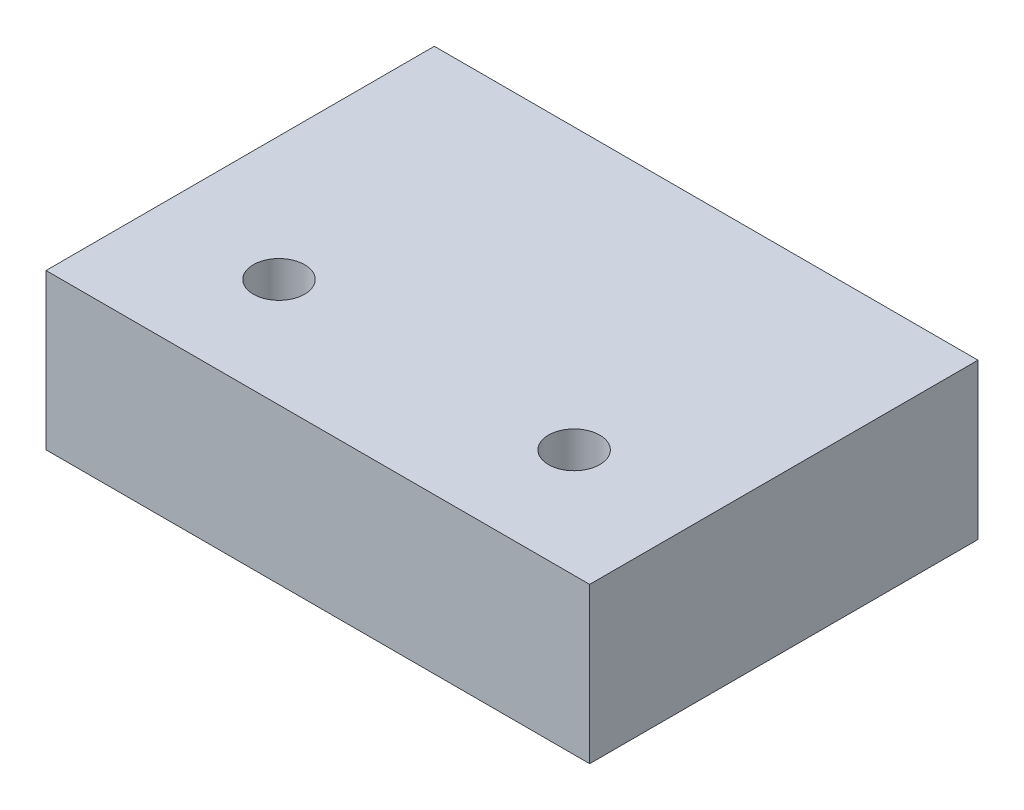
ISO-10303-21;
HEADER;
FILE_DESCRIPTION(('STEP AP214'),'2;1');
FILE_NAME('part.step','',(''),(''),'','','');
FILE_SCHEMA(('AUTOMOTIVE_DESIGN { 1 0 10303 214 1 1 1 1 }'));
ENDSEC;
DATA;
#1=APPLICATION_CONTEXT('core data for automotive mechanical design processes');
#2=APPLICATION_PROTOCOL_DEFINITION('international standard','automotive_design',2000,#1);
#3=PRODUCT_CONTEXT('',#1,'mechanical');
#4=PRODUCT('Part','Part','',(#3));
#5=PRODUCT_RELATED_PRODUCT_CATEGORY('part','',(#4));
#6=PRODUCT_DEFINITION_FORMATION('','',#4);
#7=PRODUCT_DEFINITION_CONTEXT('part definition',#1,'design');
#8=PRODUCT_DEFINITION('design','',#6,#7);
#9=PRODUCT_DEFINITION_SHAPE('','',#8);
#10=(LENGTH_UNIT() NAMED_UNIT(*) SI_UNIT(.MILLI.,.METRE.));
#11=(NAMED_UNIT(*) PLANE_ANGLE_UNIT() SI_UNIT($,.RADIAN.));
#12=(NAMED_UNIT(*) SI_UNIT($,.STERADIAN.) SOLID_ANGLE_UNIT());
#13=UNCERTAINTY_MEASURE_WITH_UNIT(LENGTH_MEASURE(1.E-05),#10,'distance_accuracy_value','');
#14=(GEOMETRIC_REPRESENTATION_CONTEXT(3) GLOBAL_UNCERTAINTY_ASSIGNED_CONTEXT((#13)) GLOBAL_UNIT_ASSIGNED_CONTEXT((#10,
#11,#12)) REPRESENTATION_CONTEXT('',''));
#15=CARTESIAN_POINT('',(0.,0.,0.));
#16=DIRECTION('',(0.,0.,1.));
#17=DIRECTION('',(1.,0.,0.));
#18=AXIS2_PLACEMENT_3D('',#15,#16,#17);
#19=CARTESIAN_POINT('',(17.5,10.,12.5));
#20=DIRECTION('',(-1.,0.,0.));
#21=DIRECTION('',(0.,0.,1.));
#22=AXIS2_PLACEMENT_3D('',#19,#20,#21);
#23=PLANE('',#22);
#24=DIRECTION('',(0.,0.,-1.));
#25=VECTOR('',#24,1.);
#26=CARTESIAN_POINT('',(17.5,0.,12.5));
#27=LINE('',#26,#25);
#28=CARTESIAN_POINT('',(17.5,0.,12.5));
#29=VERTEX_POINT('',#28);
#30=CARTESIAN_POINT('',(17.5,0.,-12.5));
#31=VERTEX_POINT('',#30);
#32=EDGE_CURVE('E96',#29,#31,#27,.T.);
#33=ORIENTED_EDGE('',*,*,#32,.T.);
#34=DIRECTION('',(0.,-1.,0.));
#35=VECTOR('',#34,1.);
#36=CARTESIAN_POINT('',(17.5,10.,-12.5));
#37=LINE('',#36,#35);
#38=CARTESIAN_POINT('',(17.5,10.,-12.5));
#39=VERTEX_POINT('',#38);
#40=EDGE_CURVE('E11',#39,#31,#37,.T.);
#41=ORIENTED_EDGE('',*,*,#40,.F.);
#42=DIRECTION('',(0.,0.,-1.));
#43=VECTOR('',#42,1.);
#44=CARTESIAN_POINT('',(17.5,10.,12.5));
#45=LINE('',#44,#43);
#46=CARTESIAN_POINT('',(17.5,10.,12.5));
#47=VERTEX_POINT('',#46);
#48=EDGE_CURVE('E84',#47,#39,#45,.T.);
#49=ORIENTED_EDGE('',*,*,#48,.F.);
#50=DIRECTION('',(0.,-1.,0.));
#51=VECTOR('',#50,1.);
#52=CARTESIAN_POINT('',(17.5,10.,12.5));
#53=LINE('',#52,#51);
#54=EDGE_CURVE('E92',#47,#29,#53,.T.);
#55=ORIENTED_EDGE('',*,*,#54,.T.);
#56=EDGE_LOOP('',(#33,#41,#49,#55));
#57=FACE_BOUND('',#56,.T.);
#58=ADVANCED_FACE('F33',(#57),#23,.F.);
#59=CARTESIAN_POINT('',(-17.5,10.,-12.5));
#60=DIRECTION('',(0.,0.,1.));
#61=DIRECTION('',(1.,0.,0.));
#62=AXIS2_PLACEMENT_3D('',#59,#60,#61);
#63=PLANE('',#62);
#64=DIRECTION('',(-1.,0.,0.));
#65=VECTOR('',#64,1.);
#66=CARTESIAN_POINT('',(-17.5,0.,-12.5));
#67=LINE('',#66,#65);
#68=CARTESIAN_POINT('',(-17.5,0.,-12.5));
#69=VERTEX_POINT('',#68);
#70=EDGE_CURVE('E88',#31,#69,#67,.T.);
#71=ORIENTED_EDGE('',*,*,#70,.T.);
#72=DIRECTION('',(0.,-1.,0.));
#73=VECTOR('',#72,1.);
#74=CARTESIAN_POINT('',(-17.5,10.,-12.5));
#75=LINE('',#74,#73);
#76=CARTESIAN_POINT('',(-17.5,10.,-12.5));
#77=VERTEX_POINT('',#76);
#78=EDGE_CURVE('E41',#77,#69,#75,.T.);
#79=ORIENTED_EDGE('',*,*,#78,.F.);
#80=DIRECTION('',(-1.,0.,0.));
#81=VECTOR('',#80,1.);
#82=CARTESIAN_POINT('',(-17.5,10.,-12.5));
#83=LINE('',#82,#81);
#84=EDGE_CURVE('E79',#39,#77,#83,.T.);
#85=ORIENTED_EDGE('',*,*,#84,.F.);
#86=ORIENTED_EDGE('',*,*,#40,.T.);
#87=EDGE_LOOP('',(#71,#79,#85,#86));
#88=FACE_BOUND('',#87,.T.);
#89=ADVANCED_FACE('F87',(#88),#63,.F.);
#90=CARTESIAN_POINT('',(-17.5,10.,12.5));
#91=DIRECTION('',(1.,0.,0.));
#92=DIRECTION('',(0.,0.,-1.));
#93=AXIS2_PLACEMENT_3D('',#90,#91,#92);
#94=PLANE('',#93);
#95=DIRECTION('',(0.,0.,1.));
#96=VECTOR('',#95,1.);
#97=CARTESIAN_POINT('',(-17.5,0.,12.5));
#98=LINE('',#97,#96);
#99=CARTESIAN_POINT('',(-17.5,0.,12.5));
#100=VERTEX_POINT('',#99);
#101=EDGE_CURVE('E66',#69,#100,#98,.T.);
#102=ORIENTED_EDGE('',*,*,#101,.T.);
#103=DIRECTION('',(0.,-1.,0.));
#104=VECTOR('',#103,1.);
#105=CARTESIAN_POINT('',(-17.5,10.,12.5));
#106=LINE('',#105,#104);
#107=CARTESIAN_POINT('',(-17.5,10.,12.5));
#108=VERTEX_POINT('',#107);
#109=EDGE_CURVE('E89',#108,#100,#106,.T.);
#110=ORIENTED_EDGE('',*,*,#109,.F.);
#111=DIRECTION('',(0.,0.,1.));
#112=VECTOR('',#111,1.);
#113=CARTESIAN_POINT('',(-17.5,10.,12.5));
#114=LINE('',#113,#112);
#115=EDGE_CURVE('E82',#77,#108,#114,.T.);
#116=ORIENTED_EDGE('',*,*,#115,.F.);
#117=ORIENTED_EDGE('',*,*,#78,.T.);
#118=EDGE_LOOP('',(#102,#110,#116,#117));
#119=FACE_BOUND('',#118,.T.);
#120=ADVANCED_FACE('F90',(#119),#94,.F.);
#121=CARTESIAN_POINT('',(-17.5,10.,12.5));
#122=DIRECTION('',(0.,0.,-1.));
#123=DIRECTION('',(-1.,0.,0.));
#124=AXIS2_PLACEMENT_3D('',#121,#122,#123);
#125=PLANE('',#124);
#126=DIRECTION('',(1.,0.,0.));
#127=VECTOR('',#126,1.);
#128=CARTESIAN_POINT('',(-17.5,0.,12.5));
#129=LINE('',#128,#127);
#130=EDGE_CURVE('E72',#100,#29,#129,.T.);
#131=ORIENTED_EDGE('',*,*,#130,.T.);
#132=ORIENTED_EDGE('',*,*,#54,.F.);
#133=DIRECTION('',(1.,0.,0.));
#134=VECTOR('',#133,1.);
#135=CARTESIAN_POINT('',(-17.5,10.,12.5));
#136=LINE('',#135,#134);
#137=EDGE_CURVE('E49',#108,#47,#136,.T.);
#138=ORIENTED_EDGE('',*,*,#137,.F.);
#139=ORIENTED_EDGE('',*,*,#109,.T.);
#140=EDGE_LOOP('',(#131,#132,#138,#139));
#141=FACE_BOUND('',#140,.T.);
#142=ADVANCED_FACE('F104',(#141),#125,.F.);
#143=CARTESIAN_POINT('',(0.,10.,0.));
#144=DIRECTION('',(0.,-1.,0.));
#145=DIRECTION('',(0.,0.,-1.));
#146=AXIS2_PLACEMENT_3D('',#143,#144,#145);
#147=PLANE('',#146);
#148=CARTESIAN_POINT('',(9.5,10.,5.5));
#149=DIRECTION('',(0.,1.,0.));
#150=DIRECTION('',(0.,0.,-1.));
#151=AXIS2_PLACEMENT_3D('',#148,#149,#150);
#152=CIRCLE('',#151,1.65);
#153=CARTESIAN_POINT('',(9.5,10.,3.85));
#154=VERTEX_POINT('',#153);
#155=EDGE_CURVE('E116',#154,#154,#152,.T.);
#156=ORIENTED_EDGE('',*,*,#155,.F.);
#157=EDGE_LOOP('',(#156));
#158=FACE_BOUND('',#157,.T.);
#159=CARTESIAN_POINT('',(-9.5,10.,5.5));
#160=DIRECTION('',(0.,1.,0.));
#161=DIRECTION('',(0.,0.,1.));
#162=AXIS2_PLACEMENT_3D('',#159,#160,#161);
#163=CIRCLE('',#162,1.65);
#164=CARTESIAN_POINT('',(-9.5,10.,7.15));
#165=VERTEX_POINT('',#164);
#166=EDGE_CURVE('E110',#165,#165,#163,.T.);
#167=ORIENTED_EDGE('',*,*,#166,.F.);
#168=EDGE_LOOP('',(#167));
#169=FACE_BOUND('',#168,.T.);
#170=ORIENTED_EDGE('',*,*,#48,.T.);
#171=ORIENTED_EDGE('',*,*,#84,.T.);
#172=ORIENTED_EDGE('',*,*,#115,.T.);
#173=ORIENTED_EDGE('',*,*,#137,.T.);
#174=EDGE_LOOP('',(#170,#171,#172,#173));
#175=FACE_BOUND('',#174,.T.);
#176=ADVANCED_FACE('F80',(#158,#169,#175),#147,.F.);
#177=CARTESIAN_POINT('',(0.,0.,0.));
#178=DIRECTION('',(0.,-1.,0.));
#179=DIRECTION('',(0.,0.,-1.));
#180=AXIS2_PLACEMENT_3D('',#177,#178,#179);
#181=PLANE('',#180);
#182=CARTESIAN_POINT('',(9.5,0.,5.5));
#183=DIRECTION('',(0.,1.,0.));
#184=DIRECTION('',(0.,0.,-1.));
#185=AXIS2_PLACEMENT_3D('',#182,#183,#184);
#186=CIRCLE('',#185,1.65);
#187=CARTESIAN_POINT('',(9.5,0.,3.85));
#188=VERTEX_POINT('',#187);
#189=EDGE_CURVE('E113',#188,#188,#186,.T.);
#190=ORIENTED_EDGE('',*,*,#189,.T.);
#191=EDGE_LOOP('',(#190));
#192=FACE_BOUND('',#191,.T.);
#193=CARTESIAN_POINT('',(-9.5,0.,5.5));
#194=DIRECTION('',(0.,1.,0.));
#195=DIRECTION('',(0.,0.,1.));
#196=AXIS2_PLACEMENT_3D('',#193,#194,#195);
#197=CIRCLE('',#196,1.65);
#198=CARTESIAN_POINT('',(-9.5,0.,7.15));
#199=VERTEX_POINT('',#198);
#200=EDGE_CURVE('E99',#199,#199,#197,.T.);
#201=ORIENTED_EDGE('',*,*,#200,.T.);
#202=EDGE_LOOP('',(#201));
#203=FACE_BOUND('',#202,.T.);
#204=ORIENTED_EDGE('',*,*,#32,.F.);
#205=ORIENTED_EDGE('',*,*,#130,.F.);
#206=ORIENTED_EDGE('',*,*,#101,.F.);
#207=ORIENTED_EDGE('',*,*,#70,.F.);
#208=EDGE_LOOP('',(#204,#205,#206,#207));
#209=FACE_BOUND('',#208,.T.);
#210=ADVANCED_FACE('F107',(#192,#203,#209),#181,.T.);
#211=CARTESIAN_POINT('',(-9.5,0.,5.5));
#212=DIRECTION('',(0.,1.,0.));
#213=DIRECTION('',(0.,0.,1.));
#214=AXIS2_PLACEMENT_3D('',#211,#212,#213);
#215=CYLINDRICAL_SURFACE('',#214,1.65);
#216=ORIENTED_EDGE('',*,*,#200,.F.);
#217=EDGE_LOOP('',(#216));
#218=FACE_BOUND('',#217,.T.);
#219=ORIENTED_EDGE('',*,*,#166,.T.);
#220=EDGE_LOOP('',(#219));
#221=FACE_BOUND('',#220,.T.);
#222=ADVANCED_FACE('F127',(#218,#221),#215,.F.);
#223=CARTESIAN_POINT('',(9.5,0.,5.5));
#224=DIRECTION('',(0.,1.,0.));
#225=DIRECTION('',(0.,0.,1.));
#226=AXIS2_PLACEMENT_3D('',#223,#224,#225);
#227=CYLINDRICAL_SURFACE('',#226,1.65);
#228=ORIENTED_EDGE('',*,*,#189,.F.);
#229=EDGE_LOOP('',(#228));
#230=FACE_BOUND('',#229,.T.);
#231=ORIENTED_EDGE('',*,*,#155,.T.);
#232=EDGE_LOOP('',(#231));
#233=FACE_BOUND('',#232,.T.);
#234=ADVANCED_FACE('F124',(#230,#233),#227,.F.);
#235=CLOSED_SHELL('',(#58,#89,#120,#142,#176,#210,#222,#234));
#236=MANIFOLD_SOLID_BREP('B2',#235);
#237=ADVANCED_BREP_SHAPE_REPRESENTATION('',(#18,#236),#14);
#238=SHAPE_DEFINITION_REPRESENTATION(#9,#237);
ENDSEC;
END-ISO-10303-21;
